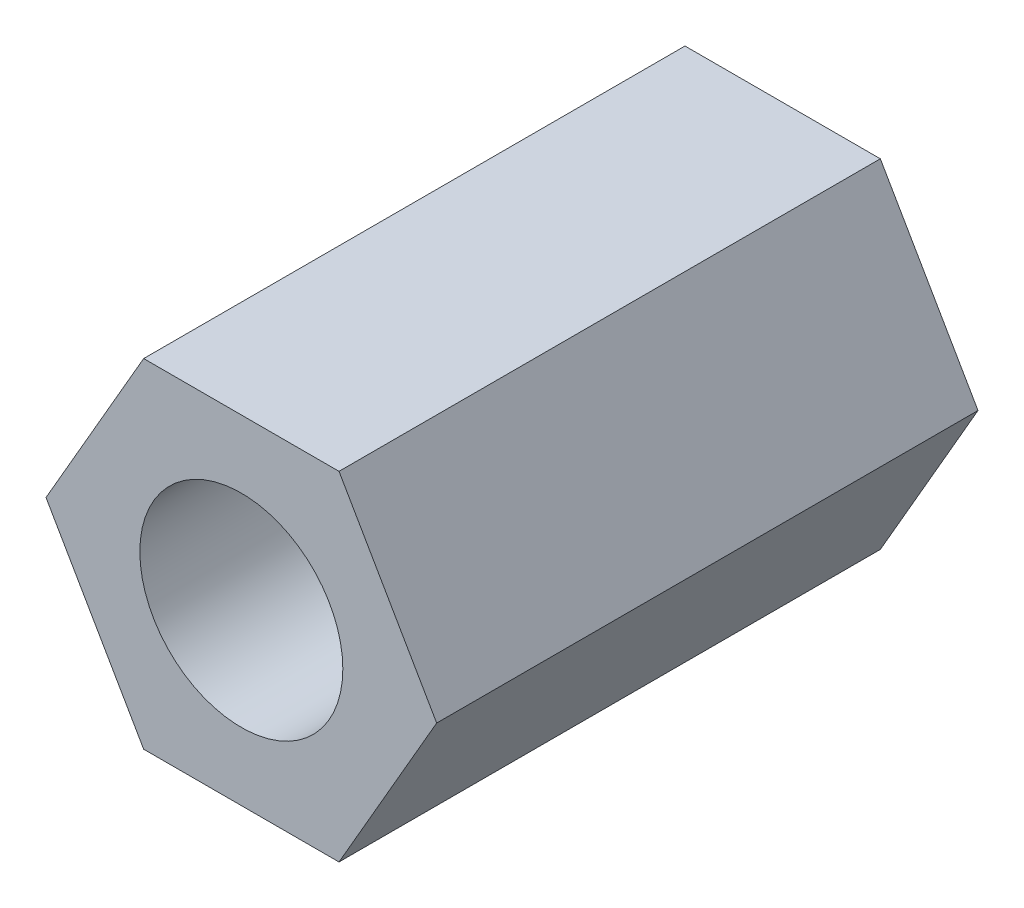
ISO-10303-21;
HEADER;
FILE_DESCRIPTION(('STEP AP214'),'2;1');
FILE_NAME('part.step','',(''),(''),'','','');
FILE_SCHEMA(('AUTOMOTIVE_DESIGN { 1 0 10303 214 1 1 1 1 }'));
ENDSEC;
DATA;
#1=APPLICATION_CONTEXT('core data for automotive mechanical design processes');
#2=APPLICATION_PROTOCOL_DEFINITION('international standard','automotive_design',2000,#1);
#3=PRODUCT_CONTEXT('',#1,'mechanical');
#4=PRODUCT('Part','Part','',(#3));
#5=PRODUCT_RELATED_PRODUCT_CATEGORY('part','',(#4));
#6=PRODUCT_DEFINITION_FORMATION('','',#4);
#7=PRODUCT_DEFINITION_CONTEXT('part definition',#1,'design');
#8=PRODUCT_DEFINITION('design','',#6,#7);
#9=PRODUCT_DEFINITION_SHAPE('','',#8);
#10=(LENGTH_UNIT() NAMED_UNIT(*) SI_UNIT(.MILLI.,.METRE.));
#11=(NAMED_UNIT(*) PLANE_ANGLE_UNIT() SI_UNIT($,.RADIAN.));
#12=(NAMED_UNIT(*) SI_UNIT($,.STERADIAN.) SOLID_ANGLE_UNIT());
#13=UNCERTAINTY_MEASURE_WITH_UNIT(LENGTH_MEASURE(1.E-05),#10,'distance_accuracy_value','');
#14=(GEOMETRIC_REPRESENTATION_CONTEXT(3) GLOBAL_UNCERTAINTY_ASSIGNED_CONTEXT((#13)) GLOBAL_UNIT_ASSIGNED_CONTEXT((#10,
#11,#12)) REPRESENTATION_CONTEXT('',''));
#15=CARTESIAN_POINT('',(0.,0.,0.));
#16=DIRECTION('',(0.,0.,1.));
#17=DIRECTION('',(1.,0.,0.));
#18=AXIS2_PLACEMENT_3D('',#15,#16,#17);
#19=CARTESIAN_POINT('',(0.,0.,8.));
#20=DIRECTION('',(0.,0.,1.));
#21=DIRECTION('',(1.,0.,0.));
#22=AXIS2_PLACEMENT_3D('',#19,#20,#21);
#23=PLANE('',#22);
#24=DIRECTION('',(-0.5,-0.866025403784439,0.));
#25=VECTOR('',#24,1.);
#26=CARTESIAN_POINT('',(-1.44337567297406,2.5,8.));
#27=LINE('',#26,#25);
#28=CARTESIAN_POINT('',(-1.44337567297406,2.5,8.));
#29=VERTEX_POINT('',#28);
#30=CARTESIAN_POINT('',(-2.88675134594813,0.,8.));
#31=VERTEX_POINT('',#30);
#32=EDGE_CURVE('E130',#29,#31,#27,.T.);
#33=ORIENTED_EDGE('',*,*,#32,.T.);
#34=DIRECTION('',(0.5,-0.866025403784439,0.));
#35=VECTOR('',#34,1.);
#36=CARTESIAN_POINT('',(-2.88675134594813,0.,8.));
#37=LINE('',#36,#35);
#38=CARTESIAN_POINT('',(-1.44337567297407,-2.5,8.));
#39=VERTEX_POINT('',#38);
#40=EDGE_CURVE('E88',#31,#39,#37,.T.);
#41=ORIENTED_EDGE('',*,*,#40,.T.);
#42=DIRECTION('',(1.,0.,0.));
#43=VECTOR('',#42,1.);
#44=CARTESIAN_POINT('',(-1.44337567297407,-2.5,8.));
#45=LINE('',#44,#43);
#46=CARTESIAN_POINT('',(1.44337567297406,-2.5,8.));
#47=VERTEX_POINT('',#46);
#48=EDGE_CURVE('E101',#39,#47,#45,.T.);
#49=ORIENTED_EDGE('',*,*,#48,.T.);
#50=DIRECTION('',(0.5,0.866025403784439,0.));
#51=VECTOR('',#50,1.);
#52=CARTESIAN_POINT('',(1.44337567297406,-2.5,8.));
#53=LINE('',#52,#51);
#54=CARTESIAN_POINT('',(2.88675134594813,0.,8.));
#55=VERTEX_POINT('',#54);
#56=EDGE_CURVE('E95',#47,#55,#53,.T.);
#57=ORIENTED_EDGE('',*,*,#56,.T.);
#58=DIRECTION('',(-0.5,0.866025403784439,0.));
#59=VECTOR('',#58,1.);
#60=CARTESIAN_POINT('',(2.88675134594813,0.,8.));
#61=LINE('',#60,#59);
#62=CARTESIAN_POINT('',(1.44337567297407,2.5,8.));
#63=VERTEX_POINT('',#62);
#64=EDGE_CURVE('E99',#55,#63,#61,.T.);
#65=ORIENTED_EDGE('',*,*,#64,.T.);
#66=DIRECTION('',(-1.,0.,0.));
#67=VECTOR('',#66,1.);
#68=CARTESIAN_POINT('',(1.44337567297407,2.5,8.));
#69=LINE('',#68,#67);
#70=EDGE_CURVE('E51',#63,#29,#69,.T.);
#71=ORIENTED_EDGE('',*,*,#70,.T.);
#72=EDGE_LOOP('',(#33,#41,#49,#57,#65,#71));
#73=FACE_BOUND('',#72,.T.);
#74=CARTESIAN_POINT('',(0.,0.,8.));
#75=DIRECTION('',(0.,0.,1.));
#76=DIRECTION('',(1.,0.,0.));
#77=AXIS2_PLACEMENT_3D('',#74,#75,#76);
#78=CIRCLE('',#77,1.5);
#79=CARTESIAN_POINT('',(1.5,0.,8.));
#80=VERTEX_POINT('',#79);
#81=EDGE_CURVE('E123',#80,#80,#78,.T.);
#82=ORIENTED_EDGE('',*,*,#81,.F.);
#83=EDGE_LOOP('',(#82));
#84=FACE_BOUND('',#83,.T.);
#85=ADVANCED_FACE('F34',(#73,#84),#23,.T.);
#86=CARTESIAN_POINT('',(0.,0.,0.));
#87=DIRECTION('',(0.,0.,1.));
#88=DIRECTION('',(1.,0.,0.));
#89=AXIS2_PLACEMENT_3D('',#86,#87,#88);
#90=PLANE('',#89);
#91=DIRECTION('',(-0.5,-0.866025403784439,0.));
#92=VECTOR('',#91,1.);
#93=CARTESIAN_POINT('',(-1.44337567297406,2.5,0.));
#94=LINE('',#93,#92);
#95=CARTESIAN_POINT('',(-1.44337567297406,2.5,0.));
#96=VERTEX_POINT('',#95);
#97=CARTESIAN_POINT('',(-2.88675134594813,0.,0.));
#98=VERTEX_POINT('',#97);
#99=EDGE_CURVE('E119',#96,#98,#94,.T.);
#100=ORIENTED_EDGE('',*,*,#99,.F.);
#101=DIRECTION('',(-1.,0.,0.));
#102=VECTOR('',#101,1.);
#103=CARTESIAN_POINT('',(1.44337567297407,2.5,0.));
#104=LINE('',#103,#102);
#105=CARTESIAN_POINT('',(1.44337567297407,2.5,0.));
#106=VERTEX_POINT('',#105);
#107=EDGE_CURVE('E80',#106,#96,#104,.T.);
#108=ORIENTED_EDGE('',*,*,#107,.F.);
#109=DIRECTION('',(-0.5,0.866025403784439,0.));
#110=VECTOR('',#109,1.);
#111=CARTESIAN_POINT('',(2.88675134594813,0.,0.));
#112=LINE('',#111,#110);
#113=CARTESIAN_POINT('',(2.88675134594813,0.,0.));
#114=VERTEX_POINT('',#113);
#115=EDGE_CURVE('E74',#114,#106,#112,.T.);
#116=ORIENTED_EDGE('',*,*,#115,.F.);
#117=DIRECTION('',(0.5,0.866025403784439,0.));
#118=VECTOR('',#117,1.);
#119=CARTESIAN_POINT('',(1.44337567297406,-2.5,0.));
#120=LINE('',#119,#118);
#121=CARTESIAN_POINT('',(1.44337567297406,-2.5,0.));
#122=VERTEX_POINT('',#121);
#123=EDGE_CURVE('E109',#122,#114,#120,.T.);
#124=ORIENTED_EDGE('',*,*,#123,.F.);
#125=DIRECTION('',(1.,0.,0.));
#126=VECTOR('',#125,1.);
#127=CARTESIAN_POINT('',(-1.44337567297407,-2.5,0.));
#128=LINE('',#127,#126);
#129=CARTESIAN_POINT('',(-1.44337567297407,-2.5,0.));
#130=VERTEX_POINT('',#129);
#131=EDGE_CURVE('E125',#130,#122,#128,.T.);
#132=ORIENTED_EDGE('',*,*,#131,.F.);
#133=DIRECTION('',(0.5,-0.866025403784439,0.));
#134=VECTOR('',#133,1.);
#135=CARTESIAN_POINT('',(-2.88675134594813,0.,0.));
#136=LINE('',#135,#134);
#137=EDGE_CURVE('E122',#98,#130,#136,.T.);
#138=ORIENTED_EDGE('',*,*,#137,.F.);
#139=EDGE_LOOP('',(#100,#108,#116,#124,#132,#138));
#140=FACE_BOUND('',#139,.T.);
#141=CARTESIAN_POINT('',(0.,0.,0.));
#142=DIRECTION('',(0.,0.,1.));
#143=DIRECTION('',(1.,0.,0.));
#144=AXIS2_PLACEMENT_3D('',#141,#142,#143);
#145=CIRCLE('',#144,1.5);
#146=CARTESIAN_POINT('',(1.5,0.,0.));
#147=VERTEX_POINT('',#146);
#148=EDGE_CURVE('E223',#147,#147,#145,.T.);
#149=ORIENTED_EDGE('',*,*,#148,.T.);
#150=EDGE_LOOP('',(#149));
#151=FACE_BOUND('',#150,.T.);
#152=ADVANCED_FACE('F139',(#140,#151),#90,.F.);
#153=CARTESIAN_POINT('',(-1.44337567297406,2.5,8.));
#154=DIRECTION('',(0.866025403784439,-0.5,0.));
#155=DIRECTION('',(0.5,0.866025403784439,0.));
#156=AXIS2_PLACEMENT_3D('',#153,#154,#155);
#157=PLANE('',#156);
#158=ORIENTED_EDGE('',*,*,#99,.T.);
#159=DIRECTION('',(0.,0.,-1.));
#160=VECTOR('',#159,1.);
#161=CARTESIAN_POINT('',(-2.88675134594813,0.,8.));
#162=LINE('',#161,#160);
#163=EDGE_CURVE('E11',#31,#98,#162,.T.);
#164=ORIENTED_EDGE('',*,*,#163,.F.);
#165=ORIENTED_EDGE('',*,*,#32,.F.);
#166=DIRECTION('',(0.,0.,-1.));
#167=VECTOR('',#166,1.);
#168=CARTESIAN_POINT('',(-1.44337567297406,2.5,8.));
#169=LINE('',#168,#167);
#170=EDGE_CURVE('E115',#29,#96,#169,.T.);
#171=ORIENTED_EDGE('',*,*,#170,.T.);
#172=EDGE_LOOP('',(#158,#164,#165,#171));
#173=FACE_BOUND('',#172,.T.);
#174=ADVANCED_FACE('F36',(#173),#157,.F.);
#175=CARTESIAN_POINT('',(-2.88675134594813,0.,8.));
#176=DIRECTION('',(0.866025403784439,0.5,0.));
#177=DIRECTION('',(-0.5,0.866025403784439,0.));
#178=AXIS2_PLACEMENT_3D('',#175,#176,#177);
#179=PLANE('',#178);
#180=ORIENTED_EDGE('',*,*,#137,.T.);
#181=DIRECTION('',(0.,0.,-1.));
#182=VECTOR('',#181,1.);
#183=CARTESIAN_POINT('',(-1.44337567297407,-2.5,8.));
#184=LINE('',#183,#182);
#185=EDGE_CURVE('E43',#39,#130,#184,.T.);
#186=ORIENTED_EDGE('',*,*,#185,.F.);
#187=ORIENTED_EDGE('',*,*,#40,.F.);
#188=ORIENTED_EDGE('',*,*,#163,.T.);
#189=EDGE_LOOP('',(#180,#186,#187,#188));
#190=FACE_BOUND('',#189,.T.);
#191=ADVANCED_FACE('F164',(#190),#179,.F.);
#192=CARTESIAN_POINT('',(-1.44337567297407,-2.5,8.));
#193=DIRECTION('',(0.,1.,0.));
#194=DIRECTION('',(-1.,0.,0.));
#195=AXIS2_PLACEMENT_3D('',#192,#193,#194);
#196=PLANE('',#195);
#197=ORIENTED_EDGE('',*,*,#131,.T.);
#198=DIRECTION('',(0.,0.,-1.));
#199=VECTOR('',#198,1.);
#200=CARTESIAN_POINT('',(1.44337567297406,-2.5,8.));
#201=LINE('',#200,#199);
#202=EDGE_CURVE('E110',#47,#122,#201,.T.);
#203=ORIENTED_EDGE('',*,*,#202,.F.);
#204=ORIENTED_EDGE('',*,*,#48,.F.);
#205=ORIENTED_EDGE('',*,*,#185,.T.);
#206=EDGE_LOOP('',(#197,#203,#204,#205));
#207=FACE_BOUND('',#206,.T.);
#208=ADVANCED_FACE('F136',(#207),#196,.F.);
#209=CARTESIAN_POINT('',(1.44337567297406,-2.5,8.));
#210=DIRECTION('',(-0.866025403784439,0.5,0.));
#211=DIRECTION('',(-0.5,-0.866025403784439,0.));
#212=AXIS2_PLACEMENT_3D('',#209,#210,#211);
#213=PLANE('',#212);
#214=ORIENTED_EDGE('',*,*,#123,.T.);
#215=DIRECTION('',(0.,0.,-1.));
#216=VECTOR('',#215,1.);
#217=CARTESIAN_POINT('',(2.88675134594813,0.,8.));
#218=LINE('',#217,#216);
#219=EDGE_CURVE('E106',#55,#114,#218,.T.);
#220=ORIENTED_EDGE('',*,*,#219,.F.);
#221=ORIENTED_EDGE('',*,*,#56,.F.);
#222=ORIENTED_EDGE('',*,*,#202,.T.);
#223=EDGE_LOOP('',(#214,#220,#221,#222));
#224=FACE_BOUND('',#223,.T.);
#225=ADVANCED_FACE('F107',(#224),#213,.F.);
#226=CARTESIAN_POINT('',(2.88675134594813,0.,8.));
#227=DIRECTION('',(-0.866025403784439,-0.5,0.));
#228=DIRECTION('',(0.5,-0.866025403784439,0.));
#229=AXIS2_PLACEMENT_3D('',#226,#227,#228);
#230=PLANE('',#229);
#231=ORIENTED_EDGE('',*,*,#115,.T.);
#232=DIRECTION('',(0.,0.,-1.));
#233=VECTOR('',#232,1.);
#234=CARTESIAN_POINT('',(1.44337567297407,2.5,8.));
#235=LINE('',#234,#233);
#236=EDGE_CURVE('E111',#63,#106,#235,.T.);
#237=ORIENTED_EDGE('',*,*,#236,.F.);
#238=ORIENTED_EDGE('',*,*,#64,.F.);
#239=ORIENTED_EDGE('',*,*,#219,.T.);
#240=EDGE_LOOP('',(#231,#237,#238,#239));
#241=FACE_BOUND('',#240,.T.);
#242=ADVANCED_FACE('F113',(#241),#230,.F.);
#243=CARTESIAN_POINT('',(1.44337567297407,2.5,8.));
#244=DIRECTION('',(0.,-1.,0.));
#245=DIRECTION('',(0.,0.,-1.));
#246=AXIS2_PLACEMENT_3D('',#243,#244,#245);
#247=PLANE('',#246);
#248=ORIENTED_EDGE('',*,*,#107,.T.);
#249=ORIENTED_EDGE('',*,*,#170,.F.);
#250=ORIENTED_EDGE('',*,*,#70,.F.);
#251=ORIENTED_EDGE('',*,*,#236,.T.);
#252=EDGE_LOOP('',(#248,#249,#250,#251));
#253=FACE_BOUND('',#252,.T.);
#254=ADVANCED_FACE('F144',(#253),#247,.F.);
#255=CARTESIAN_POINT('',(0.,0.,8.));
#256=DIRECTION('',(0.,0.,-1.));
#257=DIRECTION('',(-1.,0.,0.));
#258=AXIS2_PLACEMENT_3D('',#255,#256,#257);
#259=CYLINDRICAL_SURFACE('',#258,1.5);
#260=ORIENTED_EDGE('',*,*,#81,.T.);
#261=EDGE_LOOP('',(#260));
#262=FACE_BOUND('',#261,.T.);
#263=ORIENTED_EDGE('',*,*,#148,.F.);
#264=EDGE_LOOP('',(#263));
#265=FACE_BOUND('',#264,.T.);
#266=ADVANCED_FACE('F146',(#262,#265),#259,.F.);
#267=CLOSED_SHELL('',(#85,#152,#174,#191,#208,#225,#242,#254,#266));
#268=MANIFOLD_SOLID_BREP('B2',#267);
#269=ADVANCED_BREP_SHAPE_REPRESENTATION('',(#18,#268),#14);
#270=SHAPE_DEFINITION_REPRESENTATION(#9,#269);
ENDSEC;
END-ISO-10303-21;
